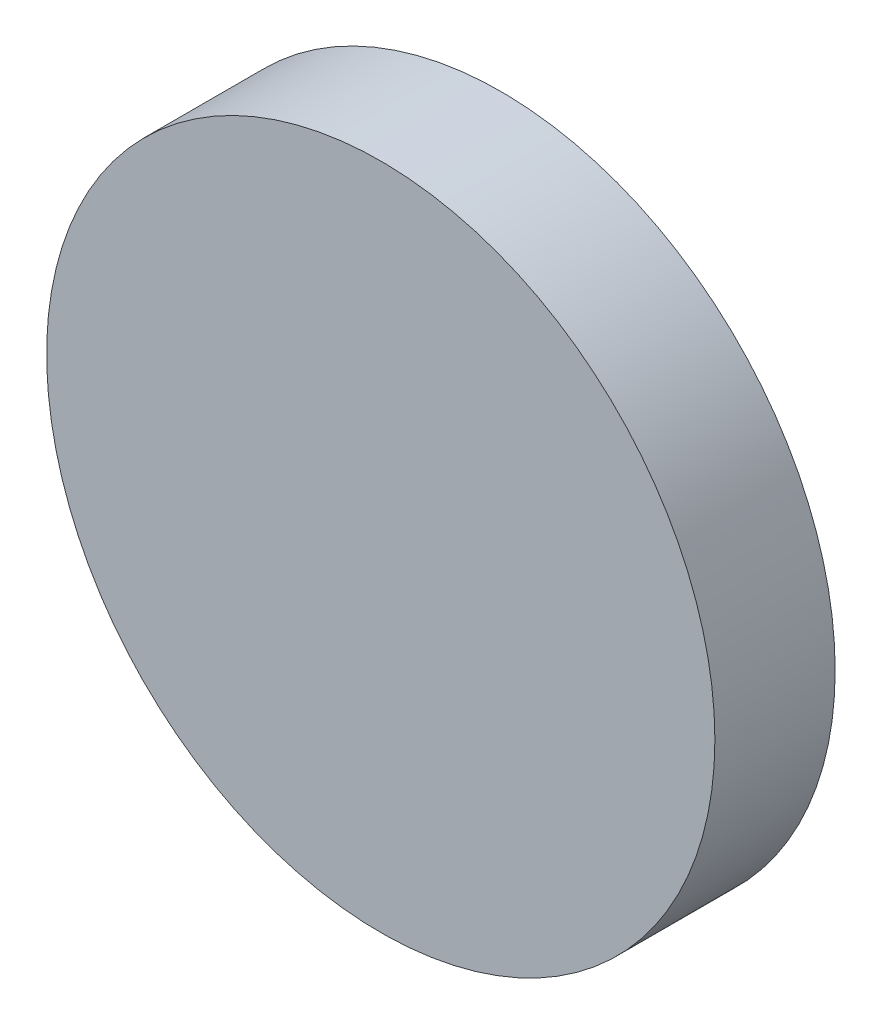
ISO-10303-21;
HEADER;
FILE_DESCRIPTION(('STEP AP214'),'2;1');
FILE_NAME('part.step','',(''),(''),'','','');
FILE_SCHEMA(('AUTOMOTIVE_DESIGN { 1 0 10303 214 1 1 1 1 }'));
ENDSEC;
DATA;
#1=APPLICATION_CONTEXT('core data for automotive mechanical design processes');
#2=APPLICATION_PROTOCOL_DEFINITION('international standard','automotive_design',2000,#1);
#3=PRODUCT_CONTEXT('',#1,'mechanical');
#4=PRODUCT('Part','Part','',(#3));
#5=PRODUCT_RELATED_PRODUCT_CATEGORY('part','',(#4));
#6=PRODUCT_DEFINITION_FORMATION('','',#4);
#7=PRODUCT_DEFINITION_CONTEXT('part definition',#1,'design');
#8=PRODUCT_DEFINITION('design','',#6,#7);
#9=PRODUCT_DEFINITION_SHAPE('','',#8);
#10=(LENGTH_UNIT() NAMED_UNIT(*) SI_UNIT(.MILLI.,.METRE.));
#11=(NAMED_UNIT(*) PLANE_ANGLE_UNIT() SI_UNIT($,.RADIAN.));
#12=(NAMED_UNIT(*) SI_UNIT($,.STERADIAN.) SOLID_ANGLE_UNIT());
#13=UNCERTAINTY_MEASURE_WITH_UNIT(LENGTH_MEASURE(1.E-05),#10,'distance_accuracy_value','');
#14=(GEOMETRIC_REPRESENTATION_CONTEXT(3) GLOBAL_UNCERTAINTY_ASSIGNED_CONTEXT((#13)) GLOBAL_UNIT_ASSIGNED_CONTEXT((#10,
#11,#12)) REPRESENTATION_CONTEXT('',''));
#15=CARTESIAN_POINT('',(0.,0.,0.));
#16=DIRECTION('',(0.,0.,1.));
#17=DIRECTION('',(1.,0.,0.));
#18=AXIS2_PLACEMENT_3D('',#15,#16,#17);
#19=CARTESIAN_POINT('',(-1.771,-1.771,-0.5));
#20=DIRECTION('',(0.,0.,1.));
#21=DIRECTION('',(1.,0.,0.));
#22=AXIS2_PLACEMENT_3D('',#19,#20,#21);
#23=PLANE('',#22);
#24=CARTESIAN_POINT('',(0.,0.,-0.5));
#25=DIRECTION('',(0.,0.,-1.));
#26=DIRECTION('',(-1.,0.,0.));
#27=AXIS2_PLACEMENT_3D('',#24,#25,#26);
#28=CIRCLE('',#27,1.75);
#29=CARTESIAN_POINT('',(-1.75,0.,-0.5));
#30=VERTEX_POINT('',#29);
#31=EDGE_CURVE('E18',#30,#30,#28,.T.);
#32=ORIENTED_EDGE('',*,*,#31,.T.);
#33=EDGE_LOOP('',(#32));
#34=FACE_BOUND('',#33,.T.);
#35=ADVANCED_FACE('F14',(#34),#23,.F.);
#36=CARTESIAN_POINT('',(0.,0.,0.));
#37=DIRECTION('',(0.,0.,-1.));
#38=DIRECTION('',(-1.,0.,0.));
#39=AXIS2_PLACEMENT_3D('',#36,#37,#38);
#40=CYLINDRICAL_SURFACE('',#39,1.75);
#41=ORIENTED_EDGE('',*,*,#31,.F.);
#42=EDGE_LOOP('',(#41));
#43=FACE_BOUND('',#42,.T.);
#44=CARTESIAN_POINT('',(0.,0.,0.));
#45=DIRECTION('',(0.,0.,-1.));
#46=DIRECTION('',(-1.,0.,0.));
#47=AXIS2_PLACEMENT_3D('',#44,#45,#46);
#48=CIRCLE('',#47,1.75);
#49=CARTESIAN_POINT('',(-1.75,0.,0.));
#50=VERTEX_POINT('',#49);
#51=EDGE_CURVE('E27',#50,#50,#48,.T.);
#52=ORIENTED_EDGE('',*,*,#51,.T.);
#53=EDGE_LOOP('',(#52));
#54=FACE_BOUND('',#53,.T.);
#55=ADVANCED_FACE('F36',(#43,#54),#40,.T.);
#56=CARTESIAN_POINT('',(-2.53,-2.53,0.9));
#57=DIRECTION('',(0.,0.,1.));
#58=DIRECTION('',(1.,0.,0.));
#59=AXIS2_PLACEMENT_3D('',#56,#57,#58);
#60=PLANE('',#59);
#61=CARTESIAN_POINT('',(0.,0.,0.9));
#62=DIRECTION('',(0.,0.,1.));
#63=DIRECTION('',(1.,0.,0.));
#64=AXIS2_PLACEMENT_3D('',#61,#62,#63);
#65=CIRCLE('',#64,2.5);
#66=CARTESIAN_POINT('',(2.5,0.,0.9));
#67=VERTEX_POINT('',#66);
#68=EDGE_CURVE('E22',#67,#67,#65,.T.);
#69=ORIENTED_EDGE('',*,*,#68,.T.);
#70=EDGE_LOOP('',(#69));
#71=FACE_BOUND('',#70,.T.);
#72=ADVANCED_FACE('F38',(#71),#60,.T.);
#73=CARTESIAN_POINT('',(-2.53,-2.53,0.));
#74=DIRECTION('',(0.,0.,1.));
#75=DIRECTION('',(1.,0.,0.));
#76=AXIS2_PLACEMENT_3D('',#73,#74,#75);
#77=PLANE('',#76);
#78=ORIENTED_EDGE('',*,*,#51,.F.);
#79=EDGE_LOOP('',(#78));
#80=FACE_BOUND('',#79,.T.);
#81=CARTESIAN_POINT('',(0.,0.,0.));
#82=DIRECTION('',(0.,0.,1.));
#83=DIRECTION('',(1.,0.,0.));
#84=AXIS2_PLACEMENT_3D('',#81,#82,#83);
#85=CIRCLE('',#84,2.5);
#86=CARTESIAN_POINT('',(2.5,0.,0.));
#87=VERTEX_POINT('',#86);
#88=EDGE_CURVE('E10',#87,#87,#85,.F.);
#89=ORIENTED_EDGE('',*,*,#88,.T.);
#90=EDGE_LOOP('',(#89));
#91=FACE_BOUND('',#90,.T.);
#92=ADVANCED_FACE('F16',(#80,#91),#77,.F.);
#93=CARTESIAN_POINT('',(0.,0.,0.));
#94=DIRECTION('',(0.,0.,1.));
#95=DIRECTION('',(1.,0.,0.));
#96=AXIS2_PLACEMENT_3D('',#93,#94,#95);
#97=CYLINDRICAL_SURFACE('',#96,2.5);
#98=ORIENTED_EDGE('',*,*,#88,.F.);
#99=EDGE_LOOP('',(#98));
#100=FACE_BOUND('',#99,.T.);
#101=ORIENTED_EDGE('',*,*,#68,.F.);
#102=EDGE_LOOP('',(#101));
#103=FACE_BOUND('',#102,.T.);
#104=ADVANCED_FACE('F48',(#100,#103),#97,.T.);
#105=CLOSED_SHELL('',(#35,#55,#72,#92,#104));
#106=MANIFOLD_SOLID_BREP('B1',#105);
#107=ADVANCED_BREP_SHAPE_REPRESENTATION('',(#18,#106),#14);
#108=SHAPE_DEFINITION_REPRESENTATION(#9,#107);
ENDSEC;
END-ISO-10303-21;
